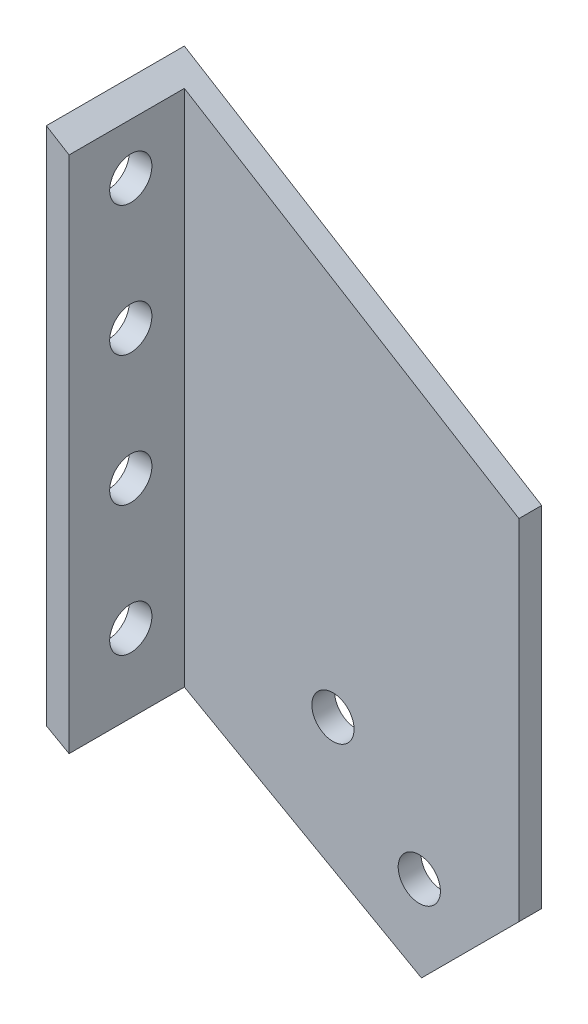
ISO-10303-21;
HEADER;
FILE_DESCRIPTION(('STEP AP214'),'2;1');
FILE_NAME('part.step','',(''),(''),'','','');
FILE_SCHEMA(('AUTOMOTIVE_DESIGN { 1 0 10303 214 1 1 1 1 }'));
ENDSEC;
DATA;
#1=APPLICATION_CONTEXT('core data for automotive mechanical design processes');
#2=APPLICATION_PROTOCOL_DEFINITION('international standard','automotive_design',2000,#1);
#3=PRODUCT_CONTEXT('',#1,'mechanical');
#4=PRODUCT('Part','Part','',(#3));
#5=PRODUCT_RELATED_PRODUCT_CATEGORY('part','',(#4));
#6=PRODUCT_DEFINITION_FORMATION('','',#4);
#7=PRODUCT_DEFINITION_CONTEXT('part definition',#1,'design');
#8=PRODUCT_DEFINITION('design','',#6,#7);
#9=PRODUCT_DEFINITION_SHAPE('','',#8);
#10=(LENGTH_UNIT() NAMED_UNIT(*) SI_UNIT(.MILLI.,.METRE.));
#11=(NAMED_UNIT(*) PLANE_ANGLE_UNIT() SI_UNIT($,.RADIAN.));
#12=(NAMED_UNIT(*) SI_UNIT($,.STERADIAN.) SOLID_ANGLE_UNIT());
#13=UNCERTAINTY_MEASURE_WITH_UNIT(LENGTH_MEASURE(1.E-05),#10,'distance_accuracy_value','');
#14=(GEOMETRIC_REPRESENTATION_CONTEXT(3) GLOBAL_UNCERTAINTY_ASSIGNED_CONTEXT((#13)) GLOBAL_UNIT_ASSIGNED_CONTEXT((#10,
#11,#12)) REPRESENTATION_CONTEXT('',''));
#15=CARTESIAN_POINT('',(0.,0.,0.));
#16=DIRECTION('',(0.,0.,1.));
#17=DIRECTION('',(1.,0.,0.));
#18=AXIS2_PLACEMENT_3D('',#15,#16,#17);
#19=CARTESIAN_POINT('',(204.674341419464,-131.464147736256,14.));
#20=DIRECTION('',(0.,0.,-1.));
#21=DIRECTION('',(-1.,0.,0.));
#22=AXIS2_PLACEMENT_3D('',#19,#20,#21);
#23=PLANE('',#22);
#24=CARTESIAN_POINT('',(10.0840119061383,-272.621329850669,14.));
#25=DIRECTION('',(0.,0.,1.));
#26=DIRECTION('',(1.,0.,0.));
#27=AXIS2_PLACEMENT_3D('',#24,#25,#26);
#28=CIRCLE('',#27,13.);
#29=CARTESIAN_POINT('',(23.0840119061383,-272.621329850669,14.));
#30=VERTEX_POINT('',#29);
#31=EDGE_CURVE('E132',#30,#30,#28,.T.);
#32=ORIENTED_EDGE('',*,*,#31,.F.);
#33=EDGE_LOOP('',(#32));
#34=FACE_BOUND('',#33,.T.);
#35=CARTESIAN_POINT('',(-43.0650952002555,-212.828584355977,14.));
#36=DIRECTION('',(0.,0.,1.));
#37=DIRECTION('',(1.,0.,0.));
#38=AXIS2_PLACEMENT_3D('',#35,#36,#37);
#39=CIRCLE('',#38,13.);
#40=CARTESIAN_POINT('',(-30.0650952002555,-212.828584355977,14.));
#41=VERTEX_POINT('',#40);
#42=EDGE_CURVE('E212',#41,#41,#39,.T.);
#43=ORIENTED_EDGE('',*,*,#42,.F.);
#44=EDGE_LOOP('',(#43));
#45=FACE_BOUND('',#44,.T.);
#46=DIRECTION('',(0.,1.,0.));
#47=VECTOR('',#46,1.);
#48=CARTESIAN_POINT('',(-134.565095200262,76.7055065531149,14.));
#49=LINE('',#48,#47);
#50=CARTESIAN_POINT('',(-134.565095200262,-242.578584355973,14.));
#51=VERTEX_POINT('',#50);
#52=CARTESIAN_POINT('',(-134.565095200262,76.7055065531149,14.));
#53=VERTEX_POINT('',#52);
#54=EDGE_CURVE('E51',#51,#53,#49,.T.);
#55=ORIENTED_EDGE('',*,*,#54,.F.);
#56=DIRECTION('',(0.87157553712455,-0.490261239632557,0.));
#57=VECTOR('',#56,1.);
#58=CARTESIAN_POINT('',(11.4349047997446,-324.703584355976,14.));
#59=LINE('',#58,#57);
#60=CARTESIAN_POINT('',(11.4349047997446,-324.703584355976,14.));
#61=VERTEX_POINT('',#60);
#62=EDGE_CURVE('E83',#51,#61,#59,.T.);
#63=ORIENTED_EDGE('',*,*,#62,.T.);
#64=DIRECTION('',(0.707106781186547,0.707106781186548,0.));
#65=VECTOR('',#64,1.);
#66=CARTESIAN_POINT('',(71.4349047997446,-264.703584355976,14.));
#67=LINE('',#66,#65);
#68=CARTESIAN_POINT('',(71.4349047997446,-264.703584355976,14.));
#69=VERTEX_POINT('',#68);
#70=EDGE_CURVE('E197',#61,#69,#67,.T.);
#71=ORIENTED_EDGE('',*,*,#70,.T.);
#72=DIRECTION('',(0.,1.,0.));
#73=VECTOR('',#72,1.);
#74=CARTESIAN_POINT('',(71.4349047997445,-49.7035843559763,14.));
#75=LINE('',#74,#73);
#76=CARTESIAN_POINT('',(71.4349047997445,-49.7035843559763,14.));
#77=VERTEX_POINT('',#76);
#78=EDGE_CURVE('E58',#69,#77,#75,.T.);
#79=ORIENTED_EDGE('',*,*,#78,.T.);
#80=DIRECTION('',(-0.852322728648673,0.523016219852579,0.));
#81=VECTOR('',#80,1.);
#82=CARTESIAN_POINT('',(-148.565095200262,85.2964156440237,14.));
#83=LINE('',#82,#81);
#84=EDGE_CURVE('E195',#77,#53,#83,.T.);
#85=ORIENTED_EDGE('',*,*,#84,.T.);
#86=EDGE_LOOP('',(#55,#63,#71,#79,#85));
#87=FACE_BOUND('',#86,.T.);
#88=ADVANCED_FACE('F34',(#34,#45,#87),#23,.F.);
#89=CARTESIAN_POINT('',(204.674341419464,-131.464147736256,0.));
#90=DIRECTION('',(0.,0.,-1.));
#91=DIRECTION('',(-1.,0.,0.));
#92=AXIS2_PLACEMENT_3D('',#89,#90,#91);
#93=PLANE('',#92);
#94=CARTESIAN_POINT('',(-43.0650952002555,-212.828584355977,0.));
#95=DIRECTION('',(0.,0.,1.));
#96=DIRECTION('',(1.,0.,0.));
#97=AXIS2_PLACEMENT_3D('',#94,#95,#96);
#98=CIRCLE('',#97,13.);
#99=CARTESIAN_POINT('',(-30.0650952002555,-212.828584355977,0.));
#100=VERTEX_POINT('',#99);
#101=EDGE_CURVE('E204',#100,#100,#98,.T.);
#102=ORIENTED_EDGE('',*,*,#101,.T.);
#103=EDGE_LOOP('',(#102));
#104=FACE_BOUND('',#103,.T.);
#105=DIRECTION('',(-0.852322728648673,0.523016219852579,0.));
#106=VECTOR('',#105,1.);
#107=CARTESIAN_POINT('',(-148.565095200262,85.2964156440237,0.));
#108=LINE('',#107,#106);
#109=CARTESIAN_POINT('',(71.4349047997445,-49.7035843559763,0.));
#110=VERTEX_POINT('',#109);
#111=CARTESIAN_POINT('',(-148.565095200262,85.2964156440237,0.));
#112=VERTEX_POINT('',#111);
#113=EDGE_CURVE('E106',#110,#112,#108,.T.);
#114=ORIENTED_EDGE('',*,*,#113,.F.);
#115=DIRECTION('',(0.,1.,0.));
#116=VECTOR('',#115,1.);
#117=CARTESIAN_POINT('',(71.4349047997445,-49.7035843559763,0.));
#118=LINE('',#117,#116);
#119=CARTESIAN_POINT('',(71.4349047997446,-264.703584355976,0.));
#120=VERTEX_POINT('',#119);
#121=EDGE_CURVE('E81',#120,#110,#118,.T.);
#122=ORIENTED_EDGE('',*,*,#121,.F.);
#123=DIRECTION('',(0.707106781186547,0.707106781186548,0.));
#124=VECTOR('',#123,1.);
#125=CARTESIAN_POINT('',(71.4349047997446,-264.703584355976,0.));
#126=LINE('',#125,#124);
#127=CARTESIAN_POINT('',(11.4349047997446,-324.703584355976,0.));
#128=VERTEX_POINT('',#127);
#129=EDGE_CURVE('E198',#128,#120,#126,.T.);
#130=ORIENTED_EDGE('',*,*,#129,.F.);
#131=DIRECTION('',(0.87157553712455,-0.490261239632557,0.));
#132=VECTOR('',#131,1.);
#133=CARTESIAN_POINT('',(11.4349047997446,-324.703584355976,0.));
#134=LINE('',#133,#132);
#135=CARTESIAN_POINT('',(-148.565095200262,-234.703584355973,0.));
#136=VERTEX_POINT('',#135);
#137=EDGE_CURVE('E214',#136,#128,#134,.T.);
#138=ORIENTED_EDGE('',*,*,#137,.F.);
#139=DIRECTION('',(0.,-1.,0.));
#140=VECTOR('',#139,1.);
#141=CARTESIAN_POINT('',(-148.565095200262,-234.703584355973,0.));
#142=LINE('',#141,#140);
#143=EDGE_CURVE('E211',#112,#136,#142,.T.);
#144=ORIENTED_EDGE('',*,*,#143,.F.);
#145=EDGE_LOOP('',(#114,#122,#130,#138,#144));
#146=FACE_BOUND('',#145,.T.);
#147=CARTESIAN_POINT('',(10.0840119061383,-272.621329850669,0.));
#148=DIRECTION('',(0.,0.,1.));
#149=DIRECTION('',(1.,0.,0.));
#150=AXIS2_PLACEMENT_3D('',#147,#148,#149);
#151=CIRCLE('',#150,13.);
#152=CARTESIAN_POINT('',(23.0840119061383,-272.621329850669,0.));
#153=VERTEX_POINT('',#152);
#154=EDGE_CURVE('E144',#153,#153,#151,.T.);
#155=ORIENTED_EDGE('',*,*,#154,.T.);
#156=EDGE_LOOP('',(#155));
#157=FACE_BOUND('',#156,.T.);
#158=ADVANCED_FACE('F226',(#104,#146,#157),#93,.T.);
#159=CARTESIAN_POINT('',(-148.565095200262,85.2964156440237,14.));
#160=DIRECTION('',(-0.523016219852579,-0.852322728648673,0.));
#161=DIRECTION('',(0.852322728648673,-0.523016219852579,0.));
#162=AXIS2_PLACEMENT_3D('',#159,#160,#161);
#163=PLANE('',#162);
#164=ORIENTED_EDGE('',*,*,#113,.T.);
#165=DIRECTION('',(0.,0.,-1.));
#166=VECTOR('',#165,1.);
#167=CARTESIAN_POINT('',(-148.565095200262,85.2964156440237,14.));
#168=LINE('',#167,#166);
#169=CARTESIAN_POINT('',(-148.565095200262,85.2964156440237,85.));
#170=VERTEX_POINT('',#169);
#171=EDGE_CURVE('E11',#170,#112,#168,.T.);
#172=ORIENTED_EDGE('',*,*,#171,.F.);
#173=DIRECTION('',(-0.852322728648673,0.523016219852578,0.));
#174=VECTOR('',#173,1.);
#175=CARTESIAN_POINT('',(-134.565095200262,76.7055065531149,85.));
#176=LINE('',#175,#174);
#177=CARTESIAN_POINT('',(-134.565095200262,76.7055065531149,85.));
#178=VERTEX_POINT('',#177);
#179=EDGE_CURVE('E104',#178,#170,#176,.T.);
#180=ORIENTED_EDGE('',*,*,#179,.F.);
#181=DIRECTION('',(0.,0.,-1.));
#182=VECTOR('',#181,1.);
#183=CARTESIAN_POINT('',(-134.565095200262,76.7055065531149,85.));
#184=LINE('',#183,#182);
#185=EDGE_CURVE('E129',#178,#53,#184,.T.);
#186=ORIENTED_EDGE('',*,*,#185,.T.);
#187=ORIENTED_EDGE('',*,*,#84,.F.);
#188=DIRECTION('',(0.,0.,-1.));
#189=VECTOR('',#188,1.);
#190=CARTESIAN_POINT('',(71.4349047997445,-49.7035843559763,14.));
#191=LINE('',#190,#189);
#192=EDGE_CURVE('E196',#77,#110,#191,.T.);
#193=ORIENTED_EDGE('',*,*,#192,.T.);
#194=EDGE_LOOP('',(#164,#172,#180,#186,#187,#193));
#195=FACE_BOUND('',#194,.T.);
#196=ADVANCED_FACE('F36',(#195),#163,.F.);
#197=CARTESIAN_POINT('',(-148.565095200262,-234.703584355973,14.));
#198=DIRECTION('',(1.,0.,0.));
#199=DIRECTION('',(0.,0.,-1.));
#200=AXIS2_PLACEMENT_3D('',#197,#198,#199);
#201=PLANE('',#200);
#202=CARTESIAN_POINT('',(-148.565095200262,-194.703584355972,47.));
#203=DIRECTION('',(-1.,0.,0.));
#204=DIRECTION('',(0.,0.,1.));
#205=AXIS2_PLACEMENT_3D('',#202,#203,#204);
#206=CIRCLE('',#205,13.);
#207=CARTESIAN_POINT('',(-148.565095200262,-194.703584355972,60.));
#208=VERTEX_POINT('',#207);
#209=EDGE_CURVE('E163',#208,#208,#206,.T.);
#210=ORIENTED_EDGE('',*,*,#209,.F.);
#211=EDGE_LOOP('',(#210));
#212=FACE_BOUND('',#211,.T.);
#213=CARTESIAN_POINT('',(-148.565095200262,-114.703584355972,47.));
#214=DIRECTION('',(-1.,0.,0.));
#215=DIRECTION('',(0.,0.,1.));
#216=AXIS2_PLACEMENT_3D('',#213,#214,#215);
#217=CIRCLE('',#216,13.);
#218=CARTESIAN_POINT('',(-148.565095200262,-114.703584355972,60.));
#219=VERTEX_POINT('',#218);
#220=EDGE_CURVE('E154',#219,#219,#217,.T.);
#221=ORIENTED_EDGE('',*,*,#220,.F.);
#222=EDGE_LOOP('',(#221));
#223=FACE_BOUND('',#222,.T.);
#224=CARTESIAN_POINT('',(-148.565095200262,-34.7035843559723,47.));
#225=DIRECTION('',(-1.,0.,0.));
#226=DIRECTION('',(0.,0.,1.));
#227=AXIS2_PLACEMENT_3D('',#224,#225,#226);
#228=CIRCLE('',#227,13.);
#229=CARTESIAN_POINT('',(-148.565095200262,-34.7035843559723,60.));
#230=VERTEX_POINT('',#229);
#231=EDGE_CURVE('E151',#230,#230,#228,.T.);
#232=ORIENTED_EDGE('',*,*,#231,.F.);
#233=EDGE_LOOP('',(#232));
#234=FACE_BOUND('',#233,.T.);
#235=CARTESIAN_POINT('',(-148.565095200262,45.2964156440277,47.));
#236=DIRECTION('',(-1.,0.,0.));
#237=DIRECTION('',(0.,0.,1.));
#238=AXIS2_PLACEMENT_3D('',#235,#236,#237);
#239=CIRCLE('',#238,13.);
#240=CARTESIAN_POINT('',(-148.565095200262,45.2964156440277,60.));
#241=VERTEX_POINT('',#240);
#242=EDGE_CURVE('E124',#241,#241,#239,.T.);
#243=ORIENTED_EDGE('',*,*,#242,.F.);
#244=EDGE_LOOP('',(#243));
#245=FACE_BOUND('',#244,.T.);
#246=ORIENTED_EDGE('',*,*,#143,.T.);
#247=DIRECTION('',(0.,0.,-1.));
#248=VECTOR('',#247,1.);
#249=CARTESIAN_POINT('',(-148.565095200262,-234.703584355973,14.));
#250=LINE('',#249,#248);
#251=CARTESIAN_POINT('',(-148.565095200262,-234.703584355973,85.));
#252=VERTEX_POINT('',#251);
#253=EDGE_CURVE('E43',#252,#136,#250,.T.);
#254=ORIENTED_EDGE('',*,*,#253,.F.);
#255=DIRECTION('',(0.,-1.,0.));
#256=VECTOR('',#255,1.);
#257=CARTESIAN_POINT('',(-148.565095200262,85.2964156440237,85.));
#258=LINE('',#257,#256);
#259=EDGE_CURVE('E109',#170,#252,#258,.T.);
#260=ORIENTED_EDGE('',*,*,#259,.F.);
#261=ORIENTED_EDGE('',*,*,#171,.T.);
#262=EDGE_LOOP('',(#246,#254,#260,#261));
#263=FACE_BOUND('',#262,.T.);
#264=ADVANCED_FACE('F110',(#212,#223,#234,#245,#263),#201,.F.);
#265=CARTESIAN_POINT('',(11.4349047997446,-324.703584355976,14.));
#266=DIRECTION('',(0.490261239632557,0.87157553712455,0.));
#267=DIRECTION('',(-0.87157553712455,0.490261239632557,0.));
#268=AXIS2_PLACEMENT_3D('',#265,#266,#267);
#269=PLANE('',#268);
#270=ORIENTED_EDGE('',*,*,#137,.T.);
#271=DIRECTION('',(0.,0.,-1.));
#272=VECTOR('',#271,1.);
#273=CARTESIAN_POINT('',(11.4349047997446,-324.703584355976,14.));
#274=LINE('',#273,#272);
#275=EDGE_CURVE('E220',#61,#128,#274,.T.);
#276=ORIENTED_EDGE('',*,*,#275,.F.);
#277=ORIENTED_EDGE('',*,*,#62,.F.);
#278=DIRECTION('',(0.,0.,-1.));
#279=VECTOR('',#278,1.);
#280=CARTESIAN_POINT('',(-134.565095200262,-242.578584355973,85.));
#281=LINE('',#280,#279);
#282=CARTESIAN_POINT('',(-134.565095200262,-242.578584355973,85.));
#283=VERTEX_POINT('',#282);
#284=EDGE_CURVE('E139',#283,#51,#281,.T.);
#285=ORIENTED_EDGE('',*,*,#284,.F.);
#286=DIRECTION('',(0.87157553712455,-0.490261239632557,0.));
#287=VECTOR('',#286,1.);
#288=CARTESIAN_POINT('',(-148.565095200262,-234.703584355973,85.));
#289=LINE('',#288,#287);
#290=EDGE_CURVE('E114',#252,#283,#289,.T.);
#291=ORIENTED_EDGE('',*,*,#290,.F.);
#292=ORIENTED_EDGE('',*,*,#253,.T.);
#293=EDGE_LOOP('',(#270,#276,#277,#285,#291,#292));
#294=FACE_BOUND('',#293,.T.);
#295=ADVANCED_FACE('F173',(#294),#269,.F.);
#296=CARTESIAN_POINT('',(71.4349047997446,-264.703584355976,14.));
#297=DIRECTION('',(-0.707106781186548,0.707106781186547,0.));
#298=DIRECTION('',(-0.707106781186547,-0.707106781186548,0.));
#299=AXIS2_PLACEMENT_3D('',#296,#297,#298);
#300=PLANE('',#299);
#301=ORIENTED_EDGE('',*,*,#129,.T.);
#302=DIRECTION('',(0.,0.,-1.));
#303=VECTOR('',#302,1.);
#304=CARTESIAN_POINT('',(71.4349047997446,-264.703584355976,14.));
#305=LINE('',#304,#303);
#306=EDGE_CURVE('E218',#69,#120,#305,.T.);
#307=ORIENTED_EDGE('',*,*,#306,.F.);
#308=ORIENTED_EDGE('',*,*,#70,.F.);
#309=ORIENTED_EDGE('',*,*,#275,.T.);
#310=EDGE_LOOP('',(#301,#307,#308,#309));
#311=FACE_BOUND('',#310,.T.);
#312=ADVANCED_FACE('F230',(#311),#300,.F.);
#313=CARTESIAN_POINT('',(71.4349047997445,-49.7035843559763,14.));
#314=DIRECTION('',(-1.,0.,0.));
#315=DIRECTION('',(0.,-1.,0.));
#316=AXIS2_PLACEMENT_3D('',#313,#314,#315);
#317=PLANE('',#316);
#318=ORIENTED_EDGE('',*,*,#121,.T.);
#319=ORIENTED_EDGE('',*,*,#192,.F.);
#320=ORIENTED_EDGE('',*,*,#78,.F.);
#321=ORIENTED_EDGE('',*,*,#306,.T.);
#322=EDGE_LOOP('',(#318,#319,#320,#321));
#323=FACE_BOUND('',#322,.T.);
#324=ADVANCED_FACE('F232',(#323),#317,.F.);
#325=CARTESIAN_POINT('',(-43.0650952002555,-212.828584355977,14.));
#326=DIRECTION('',(0.,0.,-1.));
#327=DIRECTION('',(-1.,0.,0.));
#328=AXIS2_PLACEMENT_3D('',#325,#326,#327);
#329=CYLINDRICAL_SURFACE('',#328,13.);
#330=ORIENTED_EDGE('',*,*,#42,.T.);
#331=EDGE_LOOP('',(#330));
#332=FACE_BOUND('',#331,.T.);
#333=ORIENTED_EDGE('',*,*,#101,.F.);
#334=EDGE_LOOP('',(#333));
#335=FACE_BOUND('',#334,.T.);
#336=ADVANCED_FACE('F234',(#332,#335),#329,.F.);
#337=CARTESIAN_POINT('',(10.0840119061383,-272.621329850669,14.));
#338=DIRECTION('',(0.,0.,-1.));
#339=DIRECTION('',(-1.,0.,0.));
#340=AXIS2_PLACEMENT_3D('',#337,#338,#339);
#341=CYLINDRICAL_SURFACE('',#340,13.);
#342=ORIENTED_EDGE('',*,*,#31,.T.);
#343=EDGE_LOOP('',(#342));
#344=FACE_BOUND('',#343,.T.);
#345=ORIENTED_EDGE('',*,*,#154,.F.);
#346=EDGE_LOOP('',(#345));
#347=FACE_BOUND('',#346,.T.);
#348=ADVANCED_FACE('F190',(#344,#347),#341,.F.);
#349=CARTESIAN_POINT('',(-134.565095200262,76.7055065531149,85.));
#350=DIRECTION('',(-1.,0.,0.));
#351=DIRECTION('',(0.,-1.,0.));
#352=AXIS2_PLACEMENT_3D('',#349,#350,#351);
#353=PLANE('',#352);
#354=CARTESIAN_POINT('',(-134.565095200262,-194.703584355972,47.));
#355=DIRECTION('',(-1.,0.,0.));
#356=DIRECTION('',(0.,-1.,0.));
#357=AXIS2_PLACEMENT_3D('',#354,#355,#356);
#358=CIRCLE('',#357,13.);
#359=CARTESIAN_POINT('',(-134.565095200262,-207.703584355972,47.));
#360=VERTEX_POINT('',#359);
#361=EDGE_CURVE('E38',#360,#360,#358,.T.);
#362=ORIENTED_EDGE('',*,*,#361,.T.);
#363=EDGE_LOOP('',(#362));
#364=FACE_BOUND('',#363,.T.);
#365=CARTESIAN_POINT('',(-134.565095200262,-114.703584355972,47.));
#366=DIRECTION('',(-1.,0.,0.));
#367=DIRECTION('',(0.,-1.,0.));
#368=AXIS2_PLACEMENT_3D('',#365,#366,#367);
#369=CIRCLE('',#368,13.);
#370=CARTESIAN_POINT('',(-134.565095200262,-127.703584355972,47.));
#371=VERTEX_POINT('',#370);
#372=EDGE_CURVE('E152',#371,#371,#369,.T.);
#373=ORIENTED_EDGE('',*,*,#372,.T.);
#374=EDGE_LOOP('',(#373));
#375=FACE_BOUND('',#374,.T.);
#376=CARTESIAN_POINT('',(-134.565095200262,-34.7035843559723,47.));
#377=DIRECTION('',(-1.,0.,0.));
#378=DIRECTION('',(0.,-1.,0.));
#379=AXIS2_PLACEMENT_3D('',#376,#377,#378);
#380=CIRCLE('',#379,13.);
#381=CARTESIAN_POINT('',(-134.565095200262,-47.7035843559723,47.));
#382=VERTEX_POINT('',#381);
#383=EDGE_CURVE('E149',#382,#382,#380,.T.);
#384=ORIENTED_EDGE('',*,*,#383,.T.);
#385=EDGE_LOOP('',(#384));
#386=FACE_BOUND('',#385,.T.);
#387=CARTESIAN_POINT('',(-134.565095200262,45.2964156440277,47.));
#388=DIRECTION('',(-1.,0.,0.));
#389=DIRECTION('',(0.,-1.,0.));
#390=AXIS2_PLACEMENT_3D('',#387,#388,#389);
#391=CIRCLE('',#390,13.);
#392=CARTESIAN_POINT('',(-134.565095200262,32.2964156440277,47.));
#393=VERTEX_POINT('',#392);
#394=EDGE_CURVE('E121',#393,#393,#391,.T.);
#395=ORIENTED_EDGE('',*,*,#394,.T.);
#396=EDGE_LOOP('',(#395));
#397=FACE_BOUND('',#396,.T.);
#398=ORIENTED_EDGE('',*,*,#54,.T.);
#399=ORIENTED_EDGE('',*,*,#185,.F.);
#400=DIRECTION('',(0.,1.,0.));
#401=VECTOR('',#400,1.);
#402=CARTESIAN_POINT('',(-134.565095200262,76.7055065531149,85.));
#403=LINE('',#402,#401);
#404=EDGE_CURVE('E118',#283,#178,#403,.T.);
#405=ORIENTED_EDGE('',*,*,#404,.F.);
#406=ORIENTED_EDGE('',*,*,#284,.T.);
#407=EDGE_LOOP('',(#398,#399,#405,#406));
#408=FACE_BOUND('',#407,.T.);
#409=ADVANCED_FACE('F187',(#364,#375,#386,#397,#408),#353,.F.);
#410=CARTESIAN_POINT('',(-148.565095200262,85.2964156440237,85.));
#411=DIRECTION('',(0.,0.,1.));
#412=DIRECTION('',(1.,0.,0.));
#413=AXIS2_PLACEMENT_3D('',#410,#411,#412);
#414=PLANE('',#413);
#415=ORIENTED_EDGE('',*,*,#179,.T.);
#416=ORIENTED_EDGE('',*,*,#259,.T.);
#417=ORIENTED_EDGE('',*,*,#290,.T.);
#418=ORIENTED_EDGE('',*,*,#404,.T.);
#419=EDGE_LOOP('',(#415,#416,#417,#418));
#420=FACE_BOUND('',#419,.T.);
#421=ADVANCED_FACE('F116',(#420),#414,.T.);
#422=CARTESIAN_POINT('',(71.4349297997446,45.2964156440277,47.));
#423=DIRECTION('',(-1.,0.,0.));
#424=DIRECTION('',(0.,0.,1.));
#425=AXIS2_PLACEMENT_3D('',#422,#423,#424);
#426=CYLINDRICAL_SURFACE('',#425,13.);
#427=ORIENTED_EDGE('',*,*,#242,.T.);
#428=EDGE_LOOP('',(#427));
#429=FACE_BOUND('',#428,.T.);
#430=ORIENTED_EDGE('',*,*,#394,.F.);
#431=EDGE_LOOP('',(#430));
#432=FACE_BOUND('',#431,.T.);
#433=ADVANCED_FACE('F180',(#429,#432),#426,.F.);
#434=CARTESIAN_POINT('',(71.4349297997446,-34.7035843559723,47.));
#435=DIRECTION('',(-1.,0.,0.));
#436=DIRECTION('',(0.,0.,1.));
#437=AXIS2_PLACEMENT_3D('',#434,#435,#436);
#438=CYLINDRICAL_SURFACE('',#437,13.);
#439=ORIENTED_EDGE('',*,*,#231,.T.);
#440=EDGE_LOOP('',(#439));
#441=FACE_BOUND('',#440,.T.);
#442=ORIENTED_EDGE('',*,*,#383,.F.);
#443=EDGE_LOOP('',(#442));
#444=FACE_BOUND('',#443,.T.);
#445=ADVANCED_FACE('F183',(#441,#444),#438,.F.);
#446=CARTESIAN_POINT('',(71.4349297997446,-114.703584355972,47.));
#447=DIRECTION('',(-1.,0.,0.));
#448=DIRECTION('',(0.,0.,1.));
#449=AXIS2_PLACEMENT_3D('',#446,#447,#448);
#450=CYLINDRICAL_SURFACE('',#449,13.);
#451=ORIENTED_EDGE('',*,*,#220,.T.);
#452=EDGE_LOOP('',(#451));
#453=FACE_BOUND('',#452,.T.);
#454=ORIENTED_EDGE('',*,*,#372,.F.);
#455=EDGE_LOOP('',(#454));
#456=FACE_BOUND('',#455,.T.);
#457=ADVANCED_FACE('F261',(#453,#456),#450,.F.);
#458=CARTESIAN_POINT('',(71.4349297997446,-194.703584355972,47.));
#459=DIRECTION('',(-1.,0.,0.));
#460=DIRECTION('',(0.,0.,1.));
#461=AXIS2_PLACEMENT_3D('',#458,#459,#460);
#462=CYLINDRICAL_SURFACE('',#461,13.);
#463=ORIENTED_EDGE('',*,*,#209,.T.);
#464=EDGE_LOOP('',(#463));
#465=FACE_BOUND('',#464,.T.);
#466=ORIENTED_EDGE('',*,*,#361,.F.);
#467=EDGE_LOOP('',(#466));
#468=FACE_BOUND('',#467,.T.);
#469=ADVANCED_FACE('F168',(#465,#468),#462,.F.);
#470=CLOSED_SHELL('',(#88,#158,#196,#264,#295,#312,#324,#336,#348,#409,#421,#433,#445,#457,#469));
#471=MANIFOLD_SOLID_BREP('B2',#470);
#472=ADVANCED_BREP_SHAPE_REPRESENTATION('',(#18,#471),#14);
#473=SHAPE_DEFINITION_REPRESENTATION(#9,#472);
ENDSEC;
END-ISO-10303-21;
